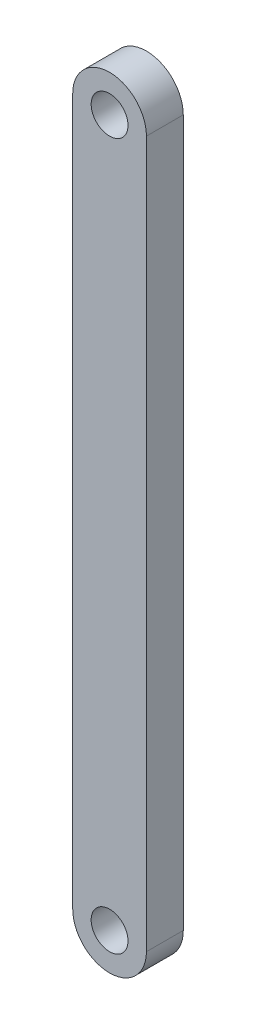
ISO-10303-21;
HEADER;
FILE_DESCRIPTION(('STEP AP214'),'2;1');
FILE_NAME('part.step','',(''),(''),'','','');
FILE_SCHEMA(('AUTOMOTIVE_DESIGN { 1 0 10303 214 1 1 1 1 }'));
ENDSEC;
DATA;
#1=APPLICATION_CONTEXT('core data for automotive mechanical design processes');
#2=APPLICATION_PROTOCOL_DEFINITION('international standard','automotive_design',2000,#1);
#3=PRODUCT_CONTEXT('',#1,'mechanical');
#4=PRODUCT('Part','Part','',(#3));
#5=PRODUCT_RELATED_PRODUCT_CATEGORY('part','',(#4));
#6=PRODUCT_DEFINITION_FORMATION('','',#4);
#7=PRODUCT_DEFINITION_CONTEXT('part definition',#1,'design');
#8=PRODUCT_DEFINITION('design','',#6,#7);
#9=PRODUCT_DEFINITION_SHAPE('','',#8);
#10=(LENGTH_UNIT() NAMED_UNIT(*) SI_UNIT(.MILLI.,.METRE.));
#11=(NAMED_UNIT(*) PLANE_ANGLE_UNIT() SI_UNIT($,.RADIAN.));
#12=(NAMED_UNIT(*) SI_UNIT($,.STERADIAN.) SOLID_ANGLE_UNIT());
#13=UNCERTAINTY_MEASURE_WITH_UNIT(LENGTH_MEASURE(1.E-05),#10,'distance_accuracy_value','');
#14=(GEOMETRIC_REPRESENTATION_CONTEXT(3) GLOBAL_UNCERTAINTY_ASSIGNED_CONTEXT((#13)) GLOBAL_UNIT_ASSIGNED_CONTEXT((#10,
#11,#12)) REPRESENTATION_CONTEXT('',''));
#15=CARTESIAN_POINT('',(0.,0.,0.));
#16=DIRECTION('',(0.,0.,1.));
#17=DIRECTION('',(1.,0.,0.));
#18=AXIS2_PLACEMENT_3D('',#15,#16,#17);
#19=CARTESIAN_POINT('',(0.,0.,6.));
#20=DIRECTION('',(0.,0.,1.));
#21=DIRECTION('',(1.,0.,0.));
#22=AXIS2_PLACEMENT_3D('',#19,#20,#21);
#23=PLANE('',#22);
#24=CARTESIAN_POINT('',(0.,0.,6.));
#25=DIRECTION('',(0.,0.,1.));
#26=DIRECTION('',(1.,0.,0.));
#27=AXIS2_PLACEMENT_3D('',#24,#25,#26);
#28=CIRCLE('',#27,3.);
#29=CARTESIAN_POINT('',(3.,0.,6.));
#30=VERTEX_POINT('',#29);
#31=EDGE_CURVE('E100',#30,#30,#28,.T.);
#32=ORIENTED_EDGE('',*,*,#31,.F.);
#33=EDGE_LOOP('',(#32));
#34=FACE_BOUND('',#33,.T.);
#35=CARTESIAN_POINT('',(0.,0.,6.));
#36=DIRECTION('',(0.,0.,1.));
#37=DIRECTION('',(1.,0.,0.));
#38=AXIS2_PLACEMENT_3D('',#35,#36,#37);
#39=CIRCLE('',#38,6.);
#40=CARTESIAN_POINT('',(-6.,0.,6.));
#41=VERTEX_POINT('',#40);
#42=CARTESIAN_POINT('',(6.,0.,6.));
#43=VERTEX_POINT('',#42);
#44=EDGE_CURVE('E85',#41,#43,#39,.T.);
#45=ORIENTED_EDGE('',*,*,#44,.T.);
#46=DIRECTION('',(0.,1.,0.));
#47=VECTOR('',#46,1.);
#48=CARTESIAN_POINT('',(6.,0.,6.));
#49=LINE('',#48,#47);
#50=CARTESIAN_POINT('',(6.,115.,6.));
#51=VERTEX_POINT('',#50);
#52=EDGE_CURVE('E80',#43,#51,#49,.T.);
#53=ORIENTED_EDGE('',*,*,#52,.T.);
#54=CARTESIAN_POINT('',(0.,115.,6.));
#55=DIRECTION('',(0.,0.,1.));
#56=DIRECTION('',(1.,0.,0.));
#57=AXIS2_PLACEMENT_3D('',#54,#55,#56);
#58=CIRCLE('',#57,6.);
#59=CARTESIAN_POINT('',(-6.,115.,6.));
#60=VERTEX_POINT('',#59);
#61=EDGE_CURVE('E83',#51,#60,#58,.T.);
#62=ORIENTED_EDGE('',*,*,#61,.T.);
#63=DIRECTION('',(0.,-1.,0.));
#64=VECTOR('',#63,1.);
#65=CARTESIAN_POINT('',(-6.,0.,6.));
#66=LINE('',#65,#64);
#67=EDGE_CURVE('E50',#60,#41,#66,.T.);
#68=ORIENTED_EDGE('',*,*,#67,.T.);
#69=EDGE_LOOP('',(#45,#53,#62,#68));
#70=FACE_BOUND('',#69,.T.);
#71=CARTESIAN_POINT('',(0.,115.,6.));
#72=DIRECTION('',(0.,0.,1.));
#73=DIRECTION('',(1.,0.,0.));
#74=AXIS2_PLACEMENT_3D('',#71,#72,#73);
#75=CIRCLE('',#74,3.);
#76=CARTESIAN_POINT('',(3.,115.,6.));
#77=VERTEX_POINT('',#76);
#78=EDGE_CURVE('E115',#77,#77,#75,.T.);
#79=ORIENTED_EDGE('',*,*,#78,.F.);
#80=EDGE_LOOP('',(#79));
#81=FACE_BOUND('',#80,.T.);
#82=ADVANCED_FACE('F33',(#34,#70,#81),#23,.T.);
#83=CARTESIAN_POINT('',(0.,0.,0.));
#84=DIRECTION('',(0.,0.,1.));
#85=DIRECTION('',(1.,0.,0.));
#86=AXIS2_PLACEMENT_3D('',#83,#84,#85);
#87=PLANE('',#86);
#88=CARTESIAN_POINT('',(0.,0.,0.));
#89=DIRECTION('',(0.,0.,1.));
#90=DIRECTION('',(1.,0.,0.));
#91=AXIS2_PLACEMENT_3D('',#88,#89,#90);
#92=CIRCLE('',#91,6.);
#93=CARTESIAN_POINT('',(-6.,0.,0.));
#94=VERTEX_POINT('',#93);
#95=CARTESIAN_POINT('',(6.,0.,0.));
#96=VERTEX_POINT('',#95);
#97=EDGE_CURVE('E97',#94,#96,#92,.T.);
#98=ORIENTED_EDGE('',*,*,#97,.F.);
#99=DIRECTION('',(0.,-1.,0.));
#100=VECTOR('',#99,1.);
#101=CARTESIAN_POINT('',(-6.,0.,0.));
#102=LINE('',#101,#100);
#103=CARTESIAN_POINT('',(-6.,115.,0.));
#104=VERTEX_POINT('',#103);
#105=EDGE_CURVE('E73',#104,#94,#102,.T.);
#106=ORIENTED_EDGE('',*,*,#105,.F.);
#107=CARTESIAN_POINT('',(0.,115.,0.));
#108=DIRECTION('',(0.,0.,1.));
#109=DIRECTION('',(1.,0.,0.));
#110=AXIS2_PLACEMENT_3D('',#107,#108,#109);
#111=CIRCLE('',#110,6.);
#112=CARTESIAN_POINT('',(6.,115.,0.));
#113=VERTEX_POINT('',#112);
#114=EDGE_CURVE('E67',#113,#104,#111,.T.);
#115=ORIENTED_EDGE('',*,*,#114,.F.);
#116=DIRECTION('',(0.,1.,0.));
#117=VECTOR('',#116,1.);
#118=CARTESIAN_POINT('',(6.,0.,0.));
#119=LINE('',#118,#117);
#120=EDGE_CURVE('E89',#96,#113,#119,.T.);
#121=ORIENTED_EDGE('',*,*,#120,.F.);
#122=EDGE_LOOP('',(#98,#106,#115,#121));
#123=FACE_BOUND('',#122,.T.);
#124=CARTESIAN_POINT('',(0.,0.,0.));
#125=DIRECTION('',(0.,0.,1.));
#126=DIRECTION('',(1.,0.,0.));
#127=AXIS2_PLACEMENT_3D('',#124,#125,#126);
#128=CIRCLE('',#127,3.);
#129=CARTESIAN_POINT('',(3.,0.,0.));
#130=VERTEX_POINT('',#129);
#131=EDGE_CURVE('E112',#130,#130,#128,.T.);
#132=ORIENTED_EDGE('',*,*,#131,.T.);
#133=EDGE_LOOP('',(#132));
#134=FACE_BOUND('',#133,.T.);
#135=CARTESIAN_POINT('',(0.,115.,0.));
#136=DIRECTION('',(0.,0.,1.));
#137=DIRECTION('',(1.,0.,0.));
#138=AXIS2_PLACEMENT_3D('',#135,#136,#137);
#139=CIRCLE('',#138,3.);
#140=CARTESIAN_POINT('',(3.,115.,0.));
#141=VERTEX_POINT('',#140);
#142=EDGE_CURVE('E118',#141,#141,#139,.T.);
#143=ORIENTED_EDGE('',*,*,#142,.T.);
#144=EDGE_LOOP('',(#143));
#145=FACE_BOUND('',#144,.T.);
#146=ADVANCED_FACE('F108',(#123,#134,#145),#87,.F.);
#147=CARTESIAN_POINT('',(0.,0.,6.));
#148=DIRECTION('',(0.,0.,-1.));
#149=DIRECTION('',(-1.,0.,0.));
#150=AXIS2_PLACEMENT_3D('',#147,#148,#149);
#151=CYLINDRICAL_SURFACE('',#150,6.);
#152=ORIENTED_EDGE('',*,*,#97,.T.);
#153=DIRECTION('',(0.,0.,-1.));
#154=VECTOR('',#153,1.);
#155=CARTESIAN_POINT('',(6.,0.,6.));
#156=LINE('',#155,#154);
#157=EDGE_CURVE('E11',#43,#96,#156,.T.);
#158=ORIENTED_EDGE('',*,*,#157,.F.);
#159=ORIENTED_EDGE('',*,*,#44,.F.);
#160=DIRECTION('',(0.,0.,-1.));
#161=VECTOR('',#160,1.);
#162=CARTESIAN_POINT('',(-6.,0.,6.));
#163=LINE('',#162,#161);
#164=EDGE_CURVE('E93',#41,#94,#163,.T.);
#165=ORIENTED_EDGE('',*,*,#164,.T.);
#166=EDGE_LOOP('',(#152,#158,#159,#165));
#167=FACE_BOUND('',#166,.T.);
#168=ADVANCED_FACE('F35',(#167),#151,.T.);
#169=CARTESIAN_POINT('',(6.,0.,6.));
#170=DIRECTION('',(-1.,0.,0.));
#171=DIRECTION('',(0.,0.,1.));
#172=AXIS2_PLACEMENT_3D('',#169,#170,#171);
#173=PLANE('',#172);
#174=ORIENTED_EDGE('',*,*,#120,.T.);
#175=DIRECTION('',(0.,0.,-1.));
#176=VECTOR('',#175,1.);
#177=CARTESIAN_POINT('',(6.,115.,6.));
#178=LINE('',#177,#176);
#179=EDGE_CURVE('E42',#51,#113,#178,.T.);
#180=ORIENTED_EDGE('',*,*,#179,.F.);
#181=ORIENTED_EDGE('',*,*,#52,.F.);
#182=ORIENTED_EDGE('',*,*,#157,.T.);
#183=EDGE_LOOP('',(#174,#180,#181,#182));
#184=FACE_BOUND('',#183,.T.);
#185=ADVANCED_FACE('F88',(#184),#173,.F.);
#186=CARTESIAN_POINT('',(0.,115.,6.));
#187=DIRECTION('',(0.,0.,-1.));
#188=DIRECTION('',(-1.,0.,0.));
#189=AXIS2_PLACEMENT_3D('',#186,#187,#188);
#190=CYLINDRICAL_SURFACE('',#189,6.);
#191=ORIENTED_EDGE('',*,*,#114,.T.);
#192=DIRECTION('',(0.,0.,-1.));
#193=VECTOR('',#192,1.);
#194=CARTESIAN_POINT('',(-6.,115.,6.));
#195=LINE('',#194,#193);
#196=EDGE_CURVE('E90',#60,#104,#195,.T.);
#197=ORIENTED_EDGE('',*,*,#196,.F.);
#198=ORIENTED_EDGE('',*,*,#61,.F.);
#199=ORIENTED_EDGE('',*,*,#179,.T.);
#200=EDGE_LOOP('',(#191,#197,#198,#199));
#201=FACE_BOUND('',#200,.T.);
#202=ADVANCED_FACE('F91',(#201),#190,.T.);
#203=CARTESIAN_POINT('',(-6.,0.,6.));
#204=DIRECTION('',(1.,0.,0.));
#205=DIRECTION('',(0.,0.,-1.));
#206=AXIS2_PLACEMENT_3D('',#203,#204,#205);
#207=PLANE('',#206);
#208=ORIENTED_EDGE('',*,*,#105,.T.);
#209=ORIENTED_EDGE('',*,*,#164,.F.);
#210=ORIENTED_EDGE('',*,*,#67,.F.);
#211=ORIENTED_EDGE('',*,*,#196,.T.);
#212=EDGE_LOOP('',(#208,#209,#210,#211));
#213=FACE_BOUND('',#212,.T.);
#214=ADVANCED_FACE('F105',(#213),#207,.F.);
#215=CARTESIAN_POINT('',(0.,0.,6.));
#216=DIRECTION('',(0.,0.,-1.));
#217=DIRECTION('',(-1.,0.,0.));
#218=AXIS2_PLACEMENT_3D('',#215,#216,#217);
#219=CYLINDRICAL_SURFACE('',#218,3.);
#220=ORIENTED_EDGE('',*,*,#31,.T.);
#221=EDGE_LOOP('',(#220));
#222=FACE_BOUND('',#221,.T.);
#223=ORIENTED_EDGE('',*,*,#131,.F.);
#224=EDGE_LOOP('',(#223));
#225=FACE_BOUND('',#224,.T.);
#226=ADVANCED_FACE('F135',(#222,#225),#219,.F.);
#227=CARTESIAN_POINT('',(0.,115.,6.));
#228=DIRECTION('',(0.,0.,-1.));
#229=DIRECTION('',(-1.,0.,0.));
#230=AXIS2_PLACEMENT_3D('',#227,#228,#229);
#231=CYLINDRICAL_SURFACE('',#230,3.);
#232=ORIENTED_EDGE('',*,*,#78,.T.);
#233=EDGE_LOOP('',(#232));
#234=FACE_BOUND('',#233,.T.);
#235=ORIENTED_EDGE('',*,*,#142,.F.);
#236=EDGE_LOOP('',(#235));
#237=FACE_BOUND('',#236,.T.);
#238=ADVANCED_FACE('F124',(#234,#237),#231,.F.);
#239=CLOSED_SHELL('',(#82,#146,#168,#185,#202,#214,#226,#238));
#240=MANIFOLD_SOLID_BREP('B2',#239);
#241=ADVANCED_BREP_SHAPE_REPRESENTATION('',(#18,#240),#14);
#242=SHAPE_DEFINITION_REPRESENTATION(#9,#241);
ENDSEC;
END-ISO-10303-21;
